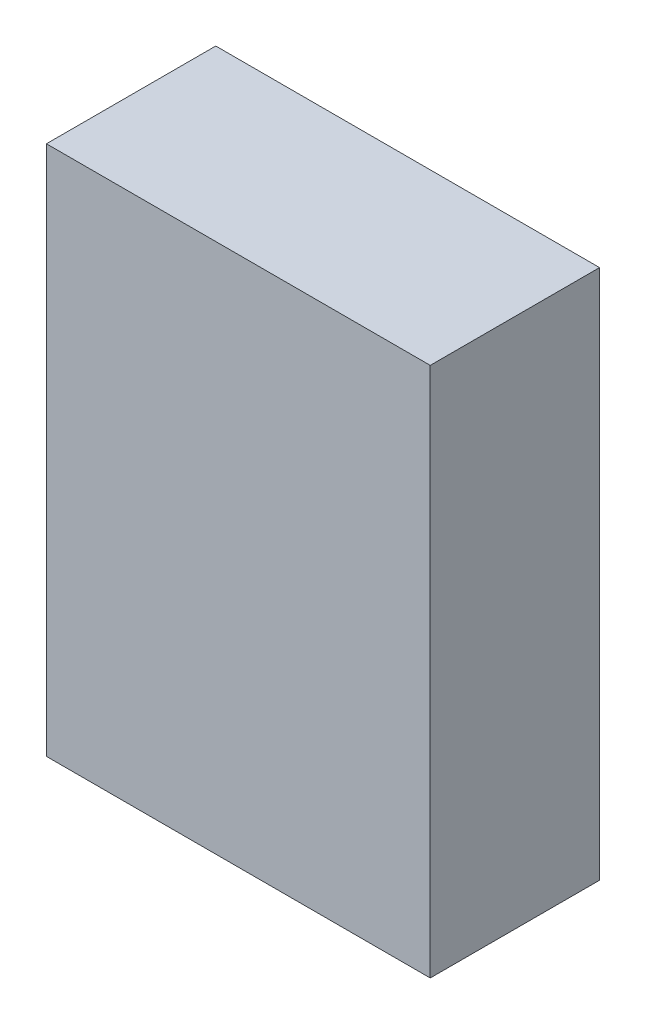
ISO-10303-21;
HEADER;
FILE_DESCRIPTION(('STEP AP214'),'2;1');
FILE_NAME('part.step','',(''),(''),'','','');
FILE_SCHEMA(('AUTOMOTIVE_DESIGN { 1 0 10303 214 1 1 1 1 }'));
ENDSEC;
DATA;
#1=APPLICATION_CONTEXT('core data for automotive mechanical design processes');
#2=APPLICATION_PROTOCOL_DEFINITION('international standard','automotive_design',2000,#1);
#3=PRODUCT_CONTEXT('',#1,'mechanical');
#4=PRODUCT('Part','Part','',(#3));
#5=PRODUCT_RELATED_PRODUCT_CATEGORY('part','',(#4));
#6=PRODUCT_DEFINITION_FORMATION('','',#4);
#7=PRODUCT_DEFINITION_CONTEXT('part definition',#1,'design');
#8=PRODUCT_DEFINITION('design','',#6,#7);
#9=PRODUCT_DEFINITION_SHAPE('','',#8);
#10=(LENGTH_UNIT() NAMED_UNIT(*) SI_UNIT(.MILLI.,.METRE.));
#11=(NAMED_UNIT(*) PLANE_ANGLE_UNIT() SI_UNIT($,.RADIAN.));
#12=(NAMED_UNIT(*) SI_UNIT($,.STERADIAN.) SOLID_ANGLE_UNIT());
#13=UNCERTAINTY_MEASURE_WITH_UNIT(LENGTH_MEASURE(1.E-05),#10,'distance_accuracy_value','');
#14=(GEOMETRIC_REPRESENTATION_CONTEXT(3) GLOBAL_UNCERTAINTY_ASSIGNED_CONTEXT((#13)) GLOBAL_UNIT_ASSIGNED_CONTEXT((#10,
#11,#12)) REPRESENTATION_CONTEXT('',''));
#15=CARTESIAN_POINT('',(0.,0.,0.));
#16=DIRECTION('',(0.,0.,1.));
#17=DIRECTION('',(1.,0.,0.));
#18=AXIS2_PLACEMENT_3D('',#15,#16,#17);
#19=CARTESIAN_POINT('',(0.,47.,0.));
#20=DIRECTION('',(1.,0.,0.));
#21=DIRECTION('',(0.,0.,-1.));
#22=AXIS2_PLACEMENT_3D('',#19,#20,#21);
#23=PLANE('',#22);
#24=DIRECTION('',(0.,0.,1.));
#25=VECTOR('',#24,1.);
#26=CARTESIAN_POINT('',(0.,0.,0.));
#27=LINE('',#26,#25);
#28=CARTESIAN_POINT('',(0.,0.,0.));
#29=VERTEX_POINT('',#28);
#30=CARTESIAN_POINT('',(0.,0.,15.));
#31=VERTEX_POINT('',#30);
#32=EDGE_CURVE('E105',#29,#31,#27,.T.);
#33=ORIENTED_EDGE('',*,*,#32,.T.);
#34=DIRECTION('',(0.,-1.,0.));
#35=VECTOR('',#34,1.);
#36=CARTESIAN_POINT('',(0.,47.,15.));
#37=LINE('',#36,#35);
#38=CARTESIAN_POINT('',(0.,47.,15.));
#39=VERTEX_POINT('',#38);
#40=EDGE_CURVE('E11',#39,#31,#37,.T.);
#41=ORIENTED_EDGE('',*,*,#40,.F.);
#42=DIRECTION('',(0.,0.,1.));
#43=VECTOR('',#42,1.);
#44=CARTESIAN_POINT('',(0.,47.,0.));
#45=LINE('',#44,#43);
#46=CARTESIAN_POINT('',(0.,47.,0.));
#47=VERTEX_POINT('',#46);
#48=EDGE_CURVE('E89',#47,#39,#45,.T.);
#49=ORIENTED_EDGE('',*,*,#48,.F.);
#50=DIRECTION('',(0.,-1.,0.));
#51=VECTOR('',#50,1.);
#52=CARTESIAN_POINT('',(0.,47.,0.));
#53=LINE('',#52,#51);
#54=EDGE_CURVE('E97',#47,#29,#53,.T.);
#55=ORIENTED_EDGE('',*,*,#54,.T.);
#56=EDGE_LOOP('',(#33,#41,#49,#55));
#57=FACE_BOUND('',#56,.T.);
#58=ADVANCED_FACE('F39',(#57),#23,.F.);
#59=CARTESIAN_POINT('',(0.,47.,15.));
#60=DIRECTION('',(0.,0.,-1.));
#61=DIRECTION('',(-1.,0.,0.));
#62=AXIS2_PLACEMENT_3D('',#59,#60,#61);
#63=PLANE('',#62);
#64=DIRECTION('',(1.,0.,0.));
#65=VECTOR('',#64,1.);
#66=CARTESIAN_POINT('',(0.,0.,15.));
#67=LINE('',#66,#65);
#68=CARTESIAN_POINT('',(34.,0.,15.));
#69=VERTEX_POINT('',#68);
#70=EDGE_CURVE('E92',#31,#69,#67,.T.);
#71=ORIENTED_EDGE('',*,*,#70,.T.);
#72=DIRECTION('',(0.,-1.,0.));
#73=VECTOR('',#72,1.);
#74=CARTESIAN_POINT('',(34.,47.,15.));
#75=LINE('',#74,#73);
#76=CARTESIAN_POINT('',(34.,47.,15.));
#77=VERTEX_POINT('',#76);
#78=EDGE_CURVE('E50',#77,#69,#75,.T.);
#79=ORIENTED_EDGE('',*,*,#78,.F.);
#80=DIRECTION('',(1.,0.,0.));
#81=VECTOR('',#80,1.);
#82=CARTESIAN_POINT('',(0.,47.,15.));
#83=LINE('',#82,#81);
#84=EDGE_CURVE('E82',#39,#77,#83,.T.);
#85=ORIENTED_EDGE('',*,*,#84,.F.);
#86=ORIENTED_EDGE('',*,*,#40,.T.);
#87=EDGE_LOOP('',(#71,#79,#85,#86));
#88=FACE_BOUND('',#87,.T.);
#89=ADVANCED_FACE('F93',(#88),#63,.F.);
#90=CARTESIAN_POINT('',(34.,47.,0.));
#91=DIRECTION('',(-1.,0.,0.));
#92=DIRECTION('',(0.,0.,1.));
#93=AXIS2_PLACEMENT_3D('',#90,#91,#92);
#94=PLANE('',#93);
#95=DIRECTION('',(0.,0.,-1.));
#96=VECTOR('',#95,1.);
#97=CARTESIAN_POINT('',(34.,0.,0.));
#98=LINE('',#97,#96);
#99=CARTESIAN_POINT('',(34.,0.,0.));
#100=VERTEX_POINT('',#99);
#101=EDGE_CURVE('E72',#69,#100,#98,.T.);
#102=ORIENTED_EDGE('',*,*,#101,.T.);
#103=DIRECTION('',(0.,-1.,0.));
#104=VECTOR('',#103,1.);
#105=CARTESIAN_POINT('',(34.,47.,0.));
#106=LINE('',#105,#104);
#107=CARTESIAN_POINT('',(34.,47.,0.));
#108=VERTEX_POINT('',#107);
#109=EDGE_CURVE('E94',#108,#100,#106,.T.);
#110=ORIENTED_EDGE('',*,*,#109,.F.);
#111=DIRECTION('',(0.,0.,-1.));
#112=VECTOR('',#111,1.);
#113=CARTESIAN_POINT('',(34.,47.,0.));
#114=LINE('',#113,#112);
#115=EDGE_CURVE('E88',#77,#108,#114,.T.);
#116=ORIENTED_EDGE('',*,*,#115,.F.);
#117=ORIENTED_EDGE('',*,*,#78,.T.);
#118=EDGE_LOOP('',(#102,#110,#116,#117));
#119=FACE_BOUND('',#118,.T.);
#120=ADVANCED_FACE('F96',(#119),#94,.F.);
#121=CARTESIAN_POINT('',(0.,47.,0.));
#122=DIRECTION('',(0.,0.,1.));
#123=DIRECTION('',(1.,0.,0.));
#124=AXIS2_PLACEMENT_3D('',#121,#122,#123);
#125=PLANE('',#124);
#126=DIRECTION('',(-1.,0.,0.));
#127=VECTOR('',#126,1.);
#128=CARTESIAN_POINT('',(0.,0.,0.));
#129=LINE('',#128,#127);
#130=EDGE_CURVE('E76',#100,#29,#129,.T.);
#131=ORIENTED_EDGE('',*,*,#130,.T.);
#132=ORIENTED_EDGE('',*,*,#54,.F.);
#133=DIRECTION('',(-1.,0.,0.));
#134=VECTOR('',#133,1.);
#135=CARTESIAN_POINT('',(0.,47.,0.));
#136=LINE('',#135,#134);
#137=EDGE_CURVE('E54',#108,#47,#136,.T.);
#138=ORIENTED_EDGE('',*,*,#137,.F.);
#139=ORIENTED_EDGE('',*,*,#109,.T.);
#140=EDGE_LOOP('',(#131,#132,#138,#139));
#141=FACE_BOUND('',#140,.T.);
#142=ADVANCED_FACE('F108',(#141),#125,.F.);
#143=CARTESIAN_POINT('',(0.,47.,0.));
#144=DIRECTION('',(0.,1.,0.));
#145=DIRECTION('',(0.,0.,1.));
#146=AXIS2_PLACEMENT_3D('',#143,#144,#145);
#147=PLANE('',#146);
#148=ORIENTED_EDGE('',*,*,#48,.T.);
#149=ORIENTED_EDGE('',*,*,#84,.T.);
#150=ORIENTED_EDGE('',*,*,#115,.T.);
#151=ORIENTED_EDGE('',*,*,#137,.T.);
#152=EDGE_LOOP('',(#148,#149,#150,#151));
#153=FACE_BOUND('',#152,.T.);
#154=ADVANCED_FACE('F86',(#153),#147,.T.);
#155=CARTESIAN_POINT('',(0.,0.,0.));
#156=DIRECTION('',(0.,1.,0.));
#157=DIRECTION('',(0.,0.,1.));
#158=AXIS2_PLACEMENT_3D('',#155,#156,#157);
#159=PLANE('',#158);
#160=ORIENTED_EDGE('',*,*,#32,.F.);
#161=ORIENTED_EDGE('',*,*,#130,.F.);
#162=ORIENTED_EDGE('',*,*,#101,.F.);
#163=ORIENTED_EDGE('',*,*,#70,.F.);
#164=EDGE_LOOP('',(#160,#161,#162,#163));
#165=FACE_BOUND('',#164,.T.);
#166=ADVANCED_FACE('F115',(#165),#159,.F.);
#167=CLOSED_SHELL('',(#58,#89,#120,#142,#154,#166));
#168=MANIFOLD_SOLID_BREP('B2',#167);
#169=ADVANCED_BREP_SHAPE_REPRESENTATION('',(#18,#168),#14);
#170=SHAPE_DEFINITION_REPRESENTATION(#9,#169);
ENDSEC;
END-ISO-10303-21;
